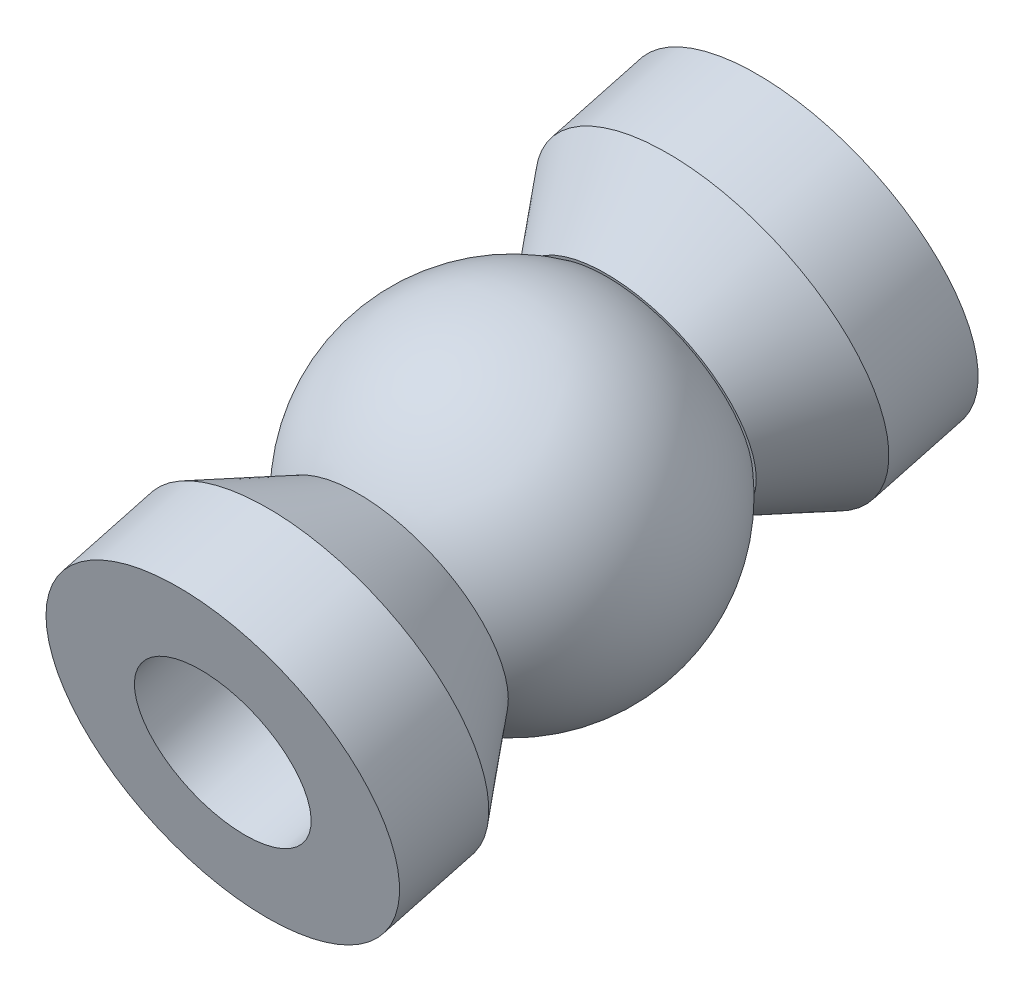
ISO-10303-21;
HEADER;
FILE_DESCRIPTION(('STEP AP214'),'2;1');
FILE_NAME('part.step','',(''),(''),'','','');
FILE_SCHEMA(('AUTOMOTIVE_DESIGN { 1 0 10303 214 1 1 1 1 }'));
ENDSEC;
DATA;
#1=APPLICATION_CONTEXT('core data for automotive mechanical design processes');
#2=APPLICATION_PROTOCOL_DEFINITION('international standard','automotive_design',2000,#1);
#3=PRODUCT_CONTEXT('',#1,'mechanical');
#4=PRODUCT('Part','Part','',(#3));
#5=PRODUCT_RELATED_PRODUCT_CATEGORY('part','',(#4));
#6=PRODUCT_DEFINITION_FORMATION('','',#4);
#7=PRODUCT_DEFINITION_CONTEXT('part definition',#1,'design');
#8=PRODUCT_DEFINITION('design','',#6,#7);
#9=PRODUCT_DEFINITION_SHAPE('','',#8);
#10=(LENGTH_UNIT() NAMED_UNIT(*) SI_UNIT(.MILLI.,.METRE.));
#11=(NAMED_UNIT(*) PLANE_ANGLE_UNIT() SI_UNIT($,.RADIAN.));
#12=(NAMED_UNIT(*) SI_UNIT($,.STERADIAN.) SOLID_ANGLE_UNIT());
#13=UNCERTAINTY_MEASURE_WITH_UNIT(LENGTH_MEASURE(1.E-05),#10,'distance_accuracy_value','');
#14=(GEOMETRIC_REPRESENTATION_CONTEXT(3) GLOBAL_UNCERTAINTY_ASSIGNED_CONTEXT((#13)) GLOBAL_UNIT_ASSIGNED_CONTEXT((#10,
#11,#12)) REPRESENTATION_CONTEXT('',''));
#15=CARTESIAN_POINT('',(0.,0.,0.));
#16=DIRECTION('',(0.,0.,1.));
#17=DIRECTION('',(1.,0.,0.));
#18=AXIS2_PLACEMENT_3D('',#15,#16,#17);
#19=CARTESIAN_POINT('',(0.,-40.3834381871204,-23.142718312818));
#20=DIRECTION('',(0.,-0.258819045102523,0.965925826289068));
#21=DIRECTION('',(0.,-0.965925826289068,-0.258819045102523));
#22=AXIS2_PLACEMENT_3D('',#19,#20,#21);
#23=PLANE('',#22);
#24=CARTESIAN_POINT('',(0.,-34.2498091901848,-21.4992173764169));
#25=DIRECTION('',(0.,-0.25881904510252,0.965925826289068));
#26=DIRECTION('',(0.,-0.965925826289068,-0.25881904510252));
#27=AXIS2_PLACEMENT_3D('',#24,#25,#26);
#28=CIRCLE('',#27,3.175);
#29=CARTESIAN_POINT('',(0.,-37.3166236886526,-22.3209678446174));
#30=VERTEX_POINT('',#29);
#31=EDGE_CURVE('E84',#30,#30,#28,.T.);
#32=ORIENTED_EDGE('',*,*,#31,.F.);
#33=EDGE_LOOP('',(#32));
#34=FACE_BOUND('',#33,.T.);
#35=CARTESIAN_POINT('',(0.,-34.2498091901848,-21.499217376417));
#36=DIRECTION('',(0.,-0.258819045102523,0.965925826289068));
#37=DIRECTION('',(0.,-0.965925826289068,-0.258819045102523));
#38=AXIS2_PLACEMENT_3D('',#35,#36,#37);
#39=CIRCLE('',#38,6.35);
#40=CARTESIAN_POINT('',(0.,-40.3834381871204,-23.142718312818));
#41=VERTEX_POINT('',#40);
#42=EDGE_CURVE('E10',#41,#41,#39,.T.);
#43=ORIENTED_EDGE('',*,*,#42,.T.);
#44=EDGE_LOOP('',(#43));
#45=FACE_BOUND('',#44,.T.);
#46=ADVANCED_FACE('F41',(#34,#45),#23,.T.);
#47=CARTESIAN_POINT('',(0.,-34.2498091901848,-21.499217376417));
#48=DIRECTION('',(0.,-0.258819045102523,0.965925826289068));
#49=DIRECTION('',(0.,-0.965925826289068,-0.258819045102523));
#50=AXIS2_PLACEMENT_3D('',#47,#48,#49);
#51=CYLINDRICAL_SURFACE('',#50,6.35);
#52=CARTESIAN_POINT('',(0.,-33.3623186845283,-24.8113770347622));
#53=DIRECTION('',(0.,-0.258819045102523,0.965925826289068));
#54=DIRECTION('',(0.,-0.965925826289068,-0.258819045102523));
#55=AXIS2_PLACEMENT_3D('',#52,#53,#54);
#56=CIRCLE('',#55,6.35000000000001);
#57=CARTESIAN_POINT('',(0.,-39.4959476814638,-26.4548779711632));
#58=VERTEX_POINT('',#57);
#59=EDGE_CURVE('E48',#58,#58,#56,.T.);
#60=ORIENTED_EDGE('',*,*,#59,.T.);
#61=EDGE_LOOP('',(#60));
#62=FACE_BOUND('',#61,.T.);
#63=ORIENTED_EDGE('',*,*,#42,.F.);
#64=EDGE_LOOP('',(#63));
#65=FACE_BOUND('',#64,.T.);
#66=ADVANCED_FACE('F92',(#62,#65),#51,.T.);
#67=CARTESIAN_POINT('',(0.,-33.3623186845283,-24.8113770347622));
#68=DIRECTION('',(0.,-0.258819045102523,0.965925826289068));
#69=DIRECTION('',(0.,-0.965925826289068,-0.258819045102523));
#70=AXIS2_PLACEMENT_3D('',#67,#68,#69);
#71=CONICAL_SURFACE('',#70,6.35,0.60780199611396);
#72=CARTESIAN_POINT('',(0.,-32.6063082537838,-27.6328463733526));
#73=DIRECTION('',(0.,-0.258819045102523,0.965925826289068));
#74=DIRECTION('',(0.,-0.965925826289068,-0.258819045102523));
#75=AXIS2_PLACEMENT_3D('',#72,#73,#74);
#76=CIRCLE('',#75,4.31800000000001);
#77=CARTESIAN_POINT('',(0.,-36.7771759717,-28.7504270101053));
#78=VERTEX_POINT('',#77);
#79=EDGE_CURVE('E53',#78,#78,#76,.T.);
#80=ORIENTED_EDGE('',*,*,#79,.T.);
#81=EDGE_LOOP('',(#80));
#82=FACE_BOUND('',#81,.T.);
#83=ORIENTED_EDGE('',*,*,#59,.F.);
#84=EDGE_LOOP('',(#83));
#85=FACE_BOUND('',#84,.T.);
#86=ADVANCED_FACE('F96',(#82,#85),#71,.T.);
#87=CARTESIAN_POINT('',(0.,-36.7771759717,-28.7504270101053));
#88=DIRECTION('',(0.,0.258819045102523,-0.965925826289068));
#89=DIRECTION('',(0.,0.965925826289068,0.258819045102523));
#90=AXIS2_PLACEMENT_3D('',#87,#88,#89);
#91=PLANE('',#90);
#92=CARTESIAN_POINT('',(0.,-32.6063082537838,-27.6328463733526));
#93=DIRECTION('',(0.,-0.258819045102523,0.965925826289068));
#94=DIRECTION('',(0.,-0.965925826289068,-0.258819045102523));
#95=AXIS2_PLACEMENT_3D('',#92,#93,#94);
#96=CIRCLE('',#95,4.20013020631505);
#97=CARTESIAN_POINT('',(0.,-36.6633224938403,-28.7199200626573));
#98=VERTEX_POINT('',#97);
#99=EDGE_CURVE('E58',#98,#98,#96,.T.);
#100=ORIENTED_EDGE('',*,*,#99,.T.);
#101=EDGE_LOOP('',(#100));
#102=FACE_BOUND('',#101,.T.);
#103=ORIENTED_EDGE('',*,*,#79,.F.);
#104=EDGE_LOOP('',(#103));
#105=FACE_BOUND('',#104,.T.);
#106=ADVANCED_FACE('F100',(#102,#105),#91,.T.);
#107=CARTESIAN_POINT('',(0.,-31.373682551483,-32.2330681210543));
#108=DIRECTION('',(0.,-0.258819045102523,0.965925826289068));
#109=DIRECTION('',(0.,-0.965925826289068,-0.258819045102523));
#110=AXIS2_PLACEMENT_3D('',#107,#108,#109);
#111=SPHERICAL_SURFACE('',#110,6.34999999999999);
#112=CARTESIAN_POINT('',(0.,-30.1410568491823,-36.833289868756));
#113=DIRECTION('',(0.,-0.258819045102523,0.965925826289068));
#114=DIRECTION('',(0.,-0.965925826289068,-0.258819045102523));
#115=AXIS2_PLACEMENT_3D('',#112,#113,#114);
#116=CIRCLE('',#115,4.20013020631505);
#117=CARTESIAN_POINT('',(0.,-34.1980710892388,-37.9203635580607));
#118=VERTEX_POINT('',#117);
#119=EDGE_CURVE('E64',#118,#118,#116,.T.);
#120=CARTESIAN_POINT('',(0.,-34.1980710892388,-37.9203635580607));
#121=CARTESIAN_POINT('',(0.,-34.2985554677224,-37.8704649888494));
#122=CARTESIAN_POINT('',(0.,-34.3977145040937,-37.8178982795775));
#123=CARTESIAN_POINT('',(0.,-34.5931098537085,-37.7075876962722));
#124=CARTESIAN_POINT('',(0.,-34.6893461669521,-37.6498438222388));
#125=CARTESIAN_POINT('',(0.,-34.8786240314086,-37.5293380247702));
#126=CARTESIAN_POINT('',(0.,-34.9716655826215,-37.4665761013351));
#127=CARTESIAN_POINT('',(0.,-35.1542930570641,-37.3362113112386));
#128=CARTESIAN_POINT('',(0.,-35.2438789802938,-37.2686084445772));
#129=CARTESIAN_POINT('',(0.,-35.4193434494303,-37.128751427196));
#130=CARTESIAN_POINT('',(0.,-35.5052219953371,-37.0564972764763));
#131=CARTESIAN_POINT('',(0.,-35.6730305315254,-36.9075406942029));
#132=CARTESIAN_POINT('',(0.,-35.7549605218069,-36.8308382626492));
#133=CARTESIAN_POINT('',(0.,-35.9146418166455,-36.6732005410995));
#134=CARTESIAN_POINT('',(0.,-35.9923931212025,-36.5922652511036));
#135=CARTESIAN_POINT('',(0.,-36.1434986627305,-36.4263891442024));
#136=CARTESIAN_POINT('',(0.,-36.2168528997014,-36.3414483272971));
#137=CARTESIAN_POINT('',(0.,-36.3589582714365,-36.1677997432667));
#138=CARTESIAN_POINT('',(0.,-36.4277094062008,-36.0790919761415));
#139=CARTESIAN_POINT('',(0.,-36.5604154686962,-35.8981586502379));
#140=CARTESIAN_POINT('',(0.,-36.6243703964273,-35.8059330914595));
#141=CARTESIAN_POINT('',(0.,-36.7473044111758,-35.6182232210393));
#142=CARTESIAN_POINT('',(0.,-36.8062834981932,-35.5227389093977));
#143=CARTESIAN_POINT('',(0.,-36.9191001738025,-35.3287797251788));
#144=CARTESIAN_POINT('',(0.,-36.9729377623944,-35.2303048526016));
#145=CARTESIAN_POINT('',(0.,-37.0753202246278,-35.0306411381603));
#146=CARTESIAN_POINT('',(0.,-37.1238650982693,-34.9294522962962));
#147=CARTESIAN_POINT('',(0.,-37.2155257800133,-34.7246448578083));
#148=CARTESIAN_POINT('',(0.,-37.2586415881157,-34.6210262611845));
#149=CARTESIAN_POINT('',(0.,-37.3393230370995,-34.4116503522848));
#150=CARTESIAN_POINT('',(0.,-37.3768886779808,-34.305893040009));
#151=CARTESIAN_POINT('',(0.,-37.4463642798924,-34.0925367460388));
#152=CARTESIAN_POINT('',(0.,-37.4782742409229,-33.9849377643444));
#153=CARTESIAN_POINT('',(0.,-37.5363488559143,-33.7682003505662));
#154=CARTESIAN_POINT('',(0.,-37.5625135098754,-33.6590619184823));
#155=CARTESIAN_POINT('',(0.,-37.6090240206618,-33.439552146891));
#156=CARTESIAN_POINT('',(0.,-37.6293698774871,-33.3291808073835));
#157=CARTESIAN_POINT('',(0.,-37.6641856475029,-33.1075152268441));
#158=CARTESIAN_POINT('',(0.,-37.6786555606933,-32.9962209858121));
#159=CARTESIAN_POINT('',(0.,-37.7016788010188,-32.7730222003256));
#160=CARTESIAN_POINT('',(0.,-37.7102321281538,-32.661117655871));
#161=CARTESIAN_POINT('',(0.,-37.7213981721784,-32.4370125758342));
#162=CARTESIAN_POINT('',(0.,-37.7240108890679,-32.3248120402519));
#163=CARTESIAN_POINT('',(0.,-37.7232883741291,-32.1004301216164));
#164=CARTESIAN_POINT('',(0.,-37.7199531423009,-31.9882487385632));
#165=CARTESIAN_POINT('',(0.,-37.7073440977495,-31.764220214864));
#166=CARTESIAN_POINT('',(0.,-37.6980702850264,-31.6523730742181));
#167=CARTESIAN_POINT('',(0.,-37.673610126621,-31.4293271863466));
#168=CARTESIAN_POINT('',(0.,-37.6584237809387,-31.3181284391212));
#169=CARTESIAN_POINT('',(0.,-37.6221812110171,-31.0966916681521));
#170=CARTESIAN_POINT('',(0.,-37.6011249867777,-30.9864536444085));
#171=CARTESIAN_POINT('',(0.,-37.5532018026125,-30.7672479511871));
#172=CARTESIAN_POINT('',(0.,-37.5263348426866,-30.6582802817094));
#173=CARTESIAN_POINT('',(0.,-37.4668656456221,-30.4419213628335));
#174=CARTESIAN_POINT('',(0.,-37.4342634084833,-30.3345301134352));
#175=CARTESIAN_POINT('',(0.,-37.3634152443091,-30.1216256610313));
#176=CARTESIAN_POINT('',(0.,-37.3251693172736,-30.0161124580258));
#177=CARTESIAN_POINT('',(0.,-37.2431411382305,-29.8072604935079));
#178=CARTESIAN_POINT('',(0.,-37.1993588862228,-29.7039217319957));
#179=CARTESIAN_POINT('',(0.,-37.1063812489747,-29.4997087747917));
#180=CARTESIAN_POINT('',(0.,-37.0571858637344,-29.3988345791001));
#181=CARTESIAN_POINT('',(0.,-36.9535193234752,-29.1998345649608));
#182=CARTESIAN_POINT('',(0.,-36.8990481684565,-29.1017087465131));
#183=CARTESIAN_POINT('',(0.,-36.7849861235614,-28.908479304257));
#184=CARTESIAN_POINT('',(0.,-36.725395233685,-28.8133756804486));
#185=CARTESIAN_POINT('',(0.,-36.6633224938403,-28.7199200626573));
#186=B_SPLINE_CURVE_WITH_KNOTS('',3,(#120,#121,#122,#123,#124,#125,#126,#127,#128,#129,#130,
#131,#132,#133,#134,#135,#136,#137,#138,#139,#140,#141,#142,#143,#144,#145,#146,#147,#148,#149,
#150,#151,#152,#153,#154,#155,#156,#157,#158,#159,#160,#161,#162,#163,#164,#165,#166,#167,#168,
#169,#170,#171,#172,#173,#174,#175,#176,#177,#178,#179,#180,#181,#182,#183,#184,#185),
.UNSPECIFIED.,.F.,.F.,(4,2,2,2,2,2,2,2,2,2,2,2,2,2,2,2,2,2,2,2,2,2,2,2,2,2,2,2,2,2,2,2,4),(0.,
0.336535239954932,0.673070479909853,1.00960571986479,1.34614095981971,1.68267619977464,
2.01921143972957,2.35574667968449,2.69228191963942,3.02881715959435,3.36535239954928,
3.7018876395042,4.03842287945913,4.37495811941405,4.71149335936898,5.04802859932391,
5.38456383927884,5.72109907923377,6.05763431918869,6.39416955914362,6.73070479909854,
7.06724003905347,7.4037752790084,7.74031051896333,8.07684575891826,8.41338099887319,
8.74991623882811,9.08645147878304,9.42298671873797,9.75952195869289,10.0960571986478,
10.4325924386027,10.7691276785577),.UNSPECIFIED.);
#187=EDGE_CURVE('BSEAM107',#118,#98,#186,.T.);
#188=ORIENTED_EDGE('',*,*,#119,.T.);
#189=ORIENTED_EDGE('',*,*,#99,.F.);
#190=ORIENTED_EDGE('',*,*,#187,.T.);
#191=ORIENTED_EDGE('',*,*,#187,.F.);
#192=EDGE_LOOP('',(#188,#190,#189,#191));
#193=FACE_BOUND('',#192,.T.);
#194=ADVANCED_FACE('F107',(#193),#111,.T.);
#195=CARTESIAN_POINT('',(0.,-34.3119245670985,-37.9508705055086));
#196=DIRECTION('',(0.,-0.258819045102523,0.965925826289068));
#197=DIRECTION('',(0.,-0.965925826289068,-0.258819045102523));
#198=AXIS2_PLACEMENT_3D('',#195,#196,#197);
#199=PLANE('',#198);
#200=CARTESIAN_POINT('',(0.,-30.1410568491823,-36.833289868756));
#201=DIRECTION('',(0.,-0.258819045102523,0.965925826289068));
#202=DIRECTION('',(0.,-0.965925826289068,-0.258819045102523));
#203=AXIS2_PLACEMENT_3D('',#200,#201,#202);
#204=CIRCLE('',#203,4.31800000000001);
#205=CARTESIAN_POINT('',(0.,-34.3119245670985,-37.9508705055087));
#206=VERTEX_POINT('',#205);
#207=EDGE_CURVE('E68',#206,#206,#204,.T.);
#208=ORIENTED_EDGE('',*,*,#207,.T.);
#209=EDGE_LOOP('',(#208));
#210=FACE_BOUND('',#209,.T.);
#211=ORIENTED_EDGE('',*,*,#119,.F.);
#212=EDGE_LOOP('',(#211));
#213=FACE_BOUND('',#212,.T.);
#214=ADVANCED_FACE('F111',(#210,#213),#199,.T.);
#215=CARTESIAN_POINT('',(0.,-30.1410568491823,-36.833289868756));
#216=DIRECTION('',(0.,0.258819045102523,-0.965925826289068));
#217=DIRECTION('',(0.,0.965925826289068,0.258819045102523));
#218=AXIS2_PLACEMENT_3D('',#215,#216,#217);
#219=CONICAL_SURFACE('',#218,4.31800000000001,0.607801996113959);
#220=CARTESIAN_POINT('',(0.,-29.3850464184378,-39.6547592073463));
#221=DIRECTION('',(0.,-0.258819045102523,0.965925826289068));
#222=DIRECTION('',(0.,-0.965925826289068,-0.258819045102523));
#223=AXIS2_PLACEMENT_3D('',#220,#221,#222);
#224=CIRCLE('',#223,6.35);
#225=CARTESIAN_POINT('',(0.,-35.5186754153734,-41.2982601437473));
#226=VERTEX_POINT('',#225);
#227=EDGE_CURVE('E72',#226,#226,#224,.T.);
#228=ORIENTED_EDGE('',*,*,#227,.T.);
#229=EDGE_LOOP('',(#228));
#230=FACE_BOUND('',#229,.T.);
#231=ORIENTED_EDGE('',*,*,#207,.F.);
#232=EDGE_LOOP('',(#231));
#233=FACE_BOUND('',#232,.T.);
#234=ADVANCED_FACE('F115',(#230,#233),#219,.T.);
#235=CARTESIAN_POINT('',(0.,-34.2498091901848,-21.499217376417));
#236=DIRECTION('',(0.,-0.258819045102523,0.965925826289068));
#237=DIRECTION('',(0.,-0.965925826289068,-0.258819045102523));
#238=AXIS2_PLACEMENT_3D('',#235,#236,#237);
#239=CYLINDRICAL_SURFACE('',#238,6.35000000000001);
#240=CARTESIAN_POINT('',(0.,-28.4975559127812,-42.9669188656915));
#241=DIRECTION('',(0.,-0.258819045102523,0.965925826289068));
#242=DIRECTION('',(0.,-0.965925826289068,-0.258819045102523));
#243=AXIS2_PLACEMENT_3D('',#240,#241,#242);
#244=CIRCLE('',#243,6.35000000000002);
#245=CARTESIAN_POINT('',(0.,-34.6311849097168,-44.6104198020926));
#246=VERTEX_POINT('',#245);
#247=EDGE_CURVE('E76',#246,#246,#244,.T.);
#248=ORIENTED_EDGE('',*,*,#247,.T.);
#249=EDGE_LOOP('',(#248));
#250=FACE_BOUND('',#249,.T.);
#251=ORIENTED_EDGE('',*,*,#227,.F.);
#252=EDGE_LOOP('',(#251));
#253=FACE_BOUND('',#252,.T.);
#254=ADVANCED_FACE('F119',(#250,#253),#239,.T.);
#255=CARTESIAN_POINT('',(0.,-34.6311849097168,-44.6104198020926));
#256=DIRECTION('',(0.,0.258819045102523,-0.965925826289068));
#257=DIRECTION('',(0.,0.965925826289068,0.258819045102523));
#258=AXIS2_PLACEMENT_3D('',#255,#256,#257);
#259=PLANE('',#258);
#260=CARTESIAN_POINT('',(0.,-28.4975559127813,-42.9669188656915));
#261=DIRECTION('',(0.,0.258819045102523,-0.965925826289068));
#262=DIRECTION('',(0.,0.965925826289068,0.258819045102523));
#263=AXIS2_PLACEMENT_3D('',#260,#261,#262);
#264=CIRCLE('',#263,3.175);
#265=CARTESIAN_POINT('',(0.,-25.4307414143135,-42.145168397491));
#266=VERTEX_POINT('',#265);
#267=EDGE_CURVE('E80',#266,#266,#264,.T.);
#268=ORIENTED_EDGE('',*,*,#267,.F.);
#269=EDGE_LOOP('',(#268));
#270=FACE_BOUND('',#269,.T.);
#271=ORIENTED_EDGE('',*,*,#247,.F.);
#272=EDGE_LOOP('',(#271));
#273=FACE_BOUND('',#272,.T.);
#274=ADVANCED_FACE('F123',(#270,#273),#259,.T.);
#275=CARTESIAN_POINT('',(0.,-34.2498091901848,-21.499217376417));
#276=DIRECTION('',(0.,-0.258819045102523,0.965925826289068));
#277=DIRECTION('',(0.,-0.965925826289068,-0.258819045102523));
#278=AXIS2_PLACEMENT_3D('',#275,#276,#277);
#279=CYLINDRICAL_SURFACE('',#278,3.17500000000001);
#280=ORIENTED_EDGE('',*,*,#267,.T.);
#281=EDGE_LOOP('',(#280));
#282=FACE_BOUND('',#281,.T.);
#283=ORIENTED_EDGE('',*,*,#31,.T.);
#284=EDGE_LOOP('',(#283));
#285=FACE_BOUND('',#284,.T.);
#286=ADVANCED_FACE('F89',(#282,#285),#279,.F.);
#287=CLOSED_SHELL('',(#46,#66,#86,#106,#194,#214,#234,#254,#274,#286));
#288=MANIFOLD_SOLID_BREP('B2',#287);
#289=ADVANCED_BREP_SHAPE_REPRESENTATION('',(#18,#288),#14);
#290=SHAPE_DEFINITION_REPRESENTATION(#9,#289);
ENDSEC;
END-ISO-10303-21;
